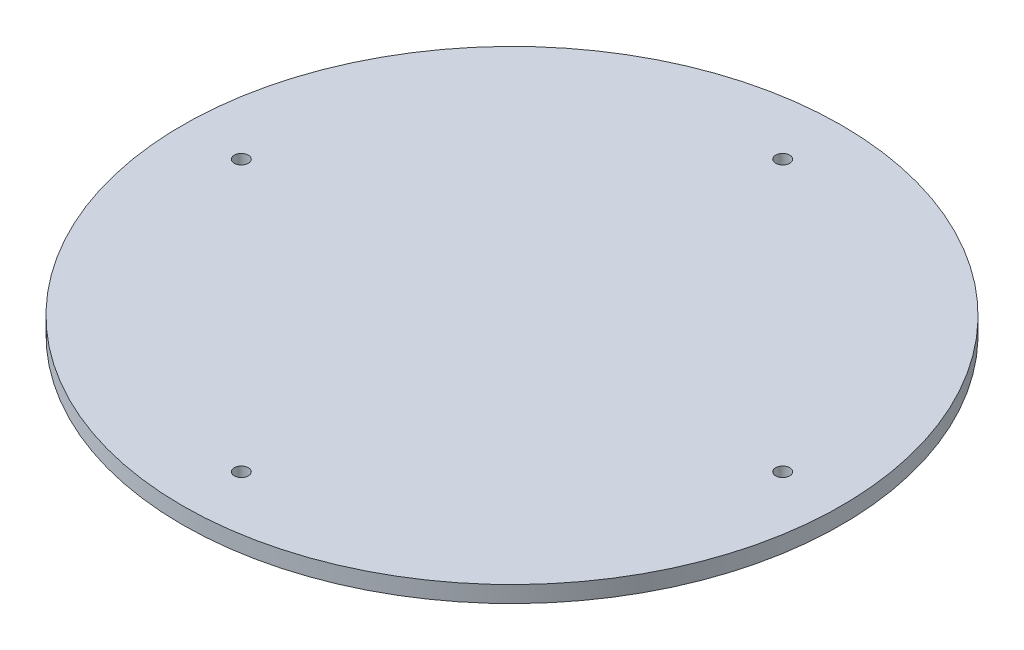
ISO-10303-21;
HEADER;
FILE_DESCRIPTION(('STEP AP214'),'2;1');
FILE_NAME('part.step','',(''),(''),'','','');
FILE_SCHEMA(('AUTOMOTIVE_DESIGN { 1 0 10303 214 1 1 1 1 }'));
ENDSEC;
DATA;
#1=APPLICATION_CONTEXT('core data for automotive mechanical design processes');
#2=APPLICATION_PROTOCOL_DEFINITION('international standard','automotive_design',2000,#1);
#3=PRODUCT_CONTEXT('',#1,'mechanical');
#4=PRODUCT('Part','Part','',(#3));
#5=PRODUCT_RELATED_PRODUCT_CATEGORY('part','',(#4));
#6=PRODUCT_DEFINITION_FORMATION('','',#4);
#7=PRODUCT_DEFINITION_CONTEXT('part definition',#1,'design');
#8=PRODUCT_DEFINITION('design','',#6,#7);
#9=PRODUCT_DEFINITION_SHAPE('','',#8);
#10=(LENGTH_UNIT() NAMED_UNIT(*) SI_UNIT(.MILLI.,.METRE.));
#11=(NAMED_UNIT(*) PLANE_ANGLE_UNIT() SI_UNIT($,.RADIAN.));
#12=(NAMED_UNIT(*) SI_UNIT($,.STERADIAN.) SOLID_ANGLE_UNIT());
#13=UNCERTAINTY_MEASURE_WITH_UNIT(LENGTH_MEASURE(1.E-05),#10,'distance_accuracy_value','');
#14=(GEOMETRIC_REPRESENTATION_CONTEXT(3) GLOBAL_UNCERTAINTY_ASSIGNED_CONTEXT((#13)) GLOBAL_UNIT_ASSIGNED_CONTEXT((#10,
#11,#12)) REPRESENTATION_CONTEXT('',''));
#15=CARTESIAN_POINT('',(0.,0.,0.));
#16=DIRECTION('',(0.,0.,1.));
#17=DIRECTION('',(1.,0.,0.));
#18=AXIS2_PLACEMENT_3D('',#15,#16,#17);
#19=CARTESIAN_POINT('',(0.,3.5,0.));
#20=DIRECTION('',(0.,-1.,0.));
#21=DIRECTION('',(0.,0.,-1.));
#22=AXIS2_PLACEMENT_3D('',#19,#20,#21);
#23=CYLINDRICAL_SURFACE('',#22,70.);
#24=CARTESIAN_POINT('',(0.,3.5,0.));
#25=DIRECTION('',(0.,1.,0.));
#26=DIRECTION('',(0.,0.,1.));
#27=AXIS2_PLACEMENT_3D('',#24,#25,#26);
#28=CIRCLE('',#27,70.);
#29=CARTESIAN_POINT('',(0.,3.5,70.));
#30=VERTEX_POINT('',#29);
#31=EDGE_CURVE('E10',#30,#30,#28,.T.);
#32=ORIENTED_EDGE('',*,*,#31,.F.);
#33=EDGE_LOOP('',(#32));
#34=FACE_BOUND('',#33,.T.);
#35=CARTESIAN_POINT('',(0.,0.,0.));
#36=DIRECTION('',(0.,1.,0.));
#37=DIRECTION('',(0.,0.,1.));
#38=AXIS2_PLACEMENT_3D('',#35,#36,#37);
#39=CIRCLE('',#38,70.);
#40=CARTESIAN_POINT('',(0.,0.,70.));
#41=VERTEX_POINT('',#40);
#42=EDGE_CURVE('E40',#41,#41,#39,.T.);
#43=ORIENTED_EDGE('',*,*,#42,.T.);
#44=EDGE_LOOP('',(#43));
#45=FACE_BOUND('',#44,.T.);
#46=ADVANCED_FACE('F37',(#34,#45),#23,.T.);
#47=CARTESIAN_POINT('',(0.,3.5,0.));
#48=DIRECTION('',(0.,1.,0.));
#49=DIRECTION('',(0.,0.,1.));
#50=AXIS2_PLACEMENT_3D('',#47,#48,#49);
#51=PLANE('',#50);
#52=CARTESIAN_POINT('',(-2.0076017698348E-13,3.5,-57.5));
#53=DIRECTION('',(0.,1.,0.));
#54=DIRECTION('',(1.,0.,0.));
#55=AXIS2_PLACEMENT_3D('',#52,#53,#54);
#56=CIRCLE('',#55,1.5);
#57=CARTESIAN_POINT('',(1.4999999999998,3.5,-57.5));
#58=VERTEX_POINT('',#57);
#59=EDGE_CURVE('E55',#58,#58,#56,.T.);
#60=ORIENTED_EDGE('',*,*,#59,.F.);
#61=EDGE_LOOP('',(#60));
#62=FACE_BOUND('',#61,.T.);
#63=CARTESIAN_POINT('',(-57.5,3.5,0.));
#64=DIRECTION('',(0.,1.,0.));
#65=DIRECTION('',(0.,0.,-1.));
#66=AXIS2_PLACEMENT_3D('',#63,#64,#65);
#67=CIRCLE('',#66,1.5);
#68=CARTESIAN_POINT('',(-57.5,3.5,-1.5));
#69=VERTEX_POINT('',#68);
#70=EDGE_CURVE('E68',#69,#69,#67,.T.);
#71=ORIENTED_EDGE('',*,*,#70,.F.);
#72=EDGE_LOOP('',(#71));
#73=FACE_BOUND('',#72,.T.);
#74=CARTESIAN_POINT('',(6.0228053095044E-13,3.5,57.5));
#75=DIRECTION('',(0.,1.,0.));
#76=DIRECTION('',(-1.,0.,0.));
#77=AXIS2_PLACEMENT_3D('',#74,#75,#76);
#78=CIRCLE('',#77,1.5);
#79=CARTESIAN_POINT('',(-1.4999999999994,3.5,57.5));
#80=VERTEX_POINT('',#79);
#81=EDGE_CURVE('E59',#80,#80,#78,.T.);
#82=ORIENTED_EDGE('',*,*,#81,.F.);
#83=EDGE_LOOP('',(#82));
#84=FACE_BOUND('',#83,.T.);
#85=CARTESIAN_POINT('',(57.5,3.5,0.));
#86=DIRECTION('',(0.,1.,0.));
#87=DIRECTION('',(0.,0.,1.));
#88=AXIS2_PLACEMENT_3D('',#85,#86,#87);
#89=CIRCLE('',#88,1.5);
#90=CARTESIAN_POINT('',(57.5,3.5,1.5));
#91=VERTEX_POINT('',#90);
#92=EDGE_CURVE('E51',#91,#91,#89,.T.);
#93=ORIENTED_EDGE('',*,*,#92,.F.);
#94=EDGE_LOOP('',(#93));
#95=FACE_BOUND('',#94,.T.);
#96=ORIENTED_EDGE('',*,*,#31,.T.);
#97=EDGE_LOOP('',(#96));
#98=FACE_BOUND('',#97,.T.);
#99=ADVANCED_FACE('F93',(#62,#73,#84,#95,#98),#51,.T.);
#100=CARTESIAN_POINT('',(0.,0.,0.));
#101=DIRECTION('',(0.,1.,0.));
#102=DIRECTION('',(0.,0.,1.));
#103=AXIS2_PLACEMENT_3D('',#100,#101,#102);
#104=PLANE('',#103);
#105=CARTESIAN_POINT('',(-2.0076017698348E-13,0.,-57.5));
#106=DIRECTION('',(0.,1.,0.));
#107=DIRECTION('',(1.,0.,0.));
#108=AXIS2_PLACEMENT_3D('',#105,#106,#107);
#109=CIRCLE('',#108,1.5);
#110=CARTESIAN_POINT('',(1.4999999999998,0.,-57.5));
#111=VERTEX_POINT('',#110);
#112=EDGE_CURVE('E72',#111,#111,#109,.T.);
#113=ORIENTED_EDGE('',*,*,#112,.T.);
#114=EDGE_LOOP('',(#113));
#115=FACE_BOUND('',#114,.T.);
#116=CARTESIAN_POINT('',(-57.5,0.,0.));
#117=DIRECTION('',(0.,1.,0.));
#118=DIRECTION('',(0.,0.,-1.));
#119=AXIS2_PLACEMENT_3D('',#116,#117,#118);
#120=CIRCLE('',#119,1.5);
#121=CARTESIAN_POINT('',(-57.5,0.,-1.5));
#122=VERTEX_POINT('',#121);
#123=EDGE_CURVE('E63',#122,#122,#120,.T.);
#124=ORIENTED_EDGE('',*,*,#123,.T.);
#125=EDGE_LOOP('',(#124));
#126=FACE_BOUND('',#125,.T.);
#127=CARTESIAN_POINT('',(6.0228053095044E-13,0.,57.5));
#128=DIRECTION('',(0.,1.,0.));
#129=DIRECTION('',(-1.,0.,0.));
#130=AXIS2_PLACEMENT_3D('',#127,#128,#129);
#131=CIRCLE('',#130,1.5);
#132=CARTESIAN_POINT('',(-1.4999999999994,0.,57.5));
#133=VERTEX_POINT('',#132);
#134=EDGE_CURVE('E64',#133,#133,#131,.T.);
#135=ORIENTED_EDGE('',*,*,#134,.T.);
#136=EDGE_LOOP('',(#135));
#137=FACE_BOUND('',#136,.T.);
#138=CARTESIAN_POINT('',(57.5,0.,0.));
#139=DIRECTION('',(0.,1.,0.));
#140=DIRECTION('',(0.,0.,1.));
#141=AXIS2_PLACEMENT_3D('',#138,#139,#140);
#142=CIRCLE('',#141,1.5);
#143=CARTESIAN_POINT('',(57.5,0.,1.5));
#144=VERTEX_POINT('',#143);
#145=EDGE_CURVE('E49',#144,#144,#142,.T.);
#146=ORIENTED_EDGE('',*,*,#145,.T.);
#147=EDGE_LOOP('',(#146));
#148=FACE_BOUND('',#147,.T.);
#149=ORIENTED_EDGE('',*,*,#42,.F.);
#150=EDGE_LOOP('',(#149));
#151=FACE_BOUND('',#150,.T.);
#152=ADVANCED_FACE('F83',(#115,#126,#137,#148,#151),#104,.F.);
#153=CARTESIAN_POINT('',(57.5,0.,0.));
#154=DIRECTION('',(0.,1.,0.));
#155=DIRECTION('',(0.,0.,1.));
#156=AXIS2_PLACEMENT_3D('',#153,#154,#155);
#157=CYLINDRICAL_SURFACE('',#156,1.5);
#158=ORIENTED_EDGE('',*,*,#145,.F.);
#159=EDGE_LOOP('',(#158));
#160=FACE_BOUND('',#159,.T.);
#161=ORIENTED_EDGE('',*,*,#92,.T.);
#162=EDGE_LOOP('',(#161));
#163=FACE_BOUND('',#162,.T.);
#164=ADVANCED_FACE('F103',(#160,#163),#157,.F.);
#165=CARTESIAN_POINT('',(6.0228053095044E-13,0.,57.5));
#166=DIRECTION('',(0.,1.,0.));
#167=DIRECTION('',(-1.,0.,0.));
#168=AXIS2_PLACEMENT_3D('',#165,#166,#167);
#169=CYLINDRICAL_SURFACE('',#168,1.5);
#170=ORIENTED_EDGE('',*,*,#134,.F.);
#171=EDGE_LOOP('',(#170));
#172=FACE_BOUND('',#171,.T.);
#173=ORIENTED_EDGE('',*,*,#81,.T.);
#174=EDGE_LOOP('',(#173));
#175=FACE_BOUND('',#174,.T.);
#176=ADVANCED_FACE('F105',(#172,#175),#169,.F.);
#177=CARTESIAN_POINT('',(-57.5,0.,0.));
#178=DIRECTION('',(0.,1.,0.));
#179=DIRECTION('',(0.,0.,-1.));
#180=AXIS2_PLACEMENT_3D('',#177,#178,#179);
#181=CYLINDRICAL_SURFACE('',#180,1.5);
#182=ORIENTED_EDGE('',*,*,#123,.F.);
#183=EDGE_LOOP('',(#182));
#184=FACE_BOUND('',#183,.T.);
#185=ORIENTED_EDGE('',*,*,#70,.T.);
#186=EDGE_LOOP('',(#185));
#187=FACE_BOUND('',#186,.T.);
#188=ADVANCED_FACE('F89',(#184,#187),#181,.F.);
#189=CARTESIAN_POINT('',(-2.0076017698348E-13,0.,-57.5));
#190=DIRECTION('',(0.,1.,0.));
#191=DIRECTION('',(1.,0.,0.));
#192=AXIS2_PLACEMENT_3D('',#189,#190,#191);
#193=CYLINDRICAL_SURFACE('',#192,1.5);
#194=ORIENTED_EDGE('',*,*,#112,.F.);
#195=EDGE_LOOP('',(#194));
#196=FACE_BOUND('',#195,.T.);
#197=ORIENTED_EDGE('',*,*,#59,.T.);
#198=EDGE_LOOP('',(#197));
#199=FACE_BOUND('',#198,.T.);
#200=ADVANCED_FACE('F86',(#196,#199),#193,.F.);
#201=CLOSED_SHELL('',(#46,#99,#152,#164,#176,#188,#200));
#202=MANIFOLD_SOLID_BREP('B2',#201);
#203=ADVANCED_BREP_SHAPE_REPRESENTATION('',(#18,#202),#14);
#204=SHAPE_DEFINITION_REPRESENTATION(#9,#203);
ENDSEC;
END-ISO-10303-21;
